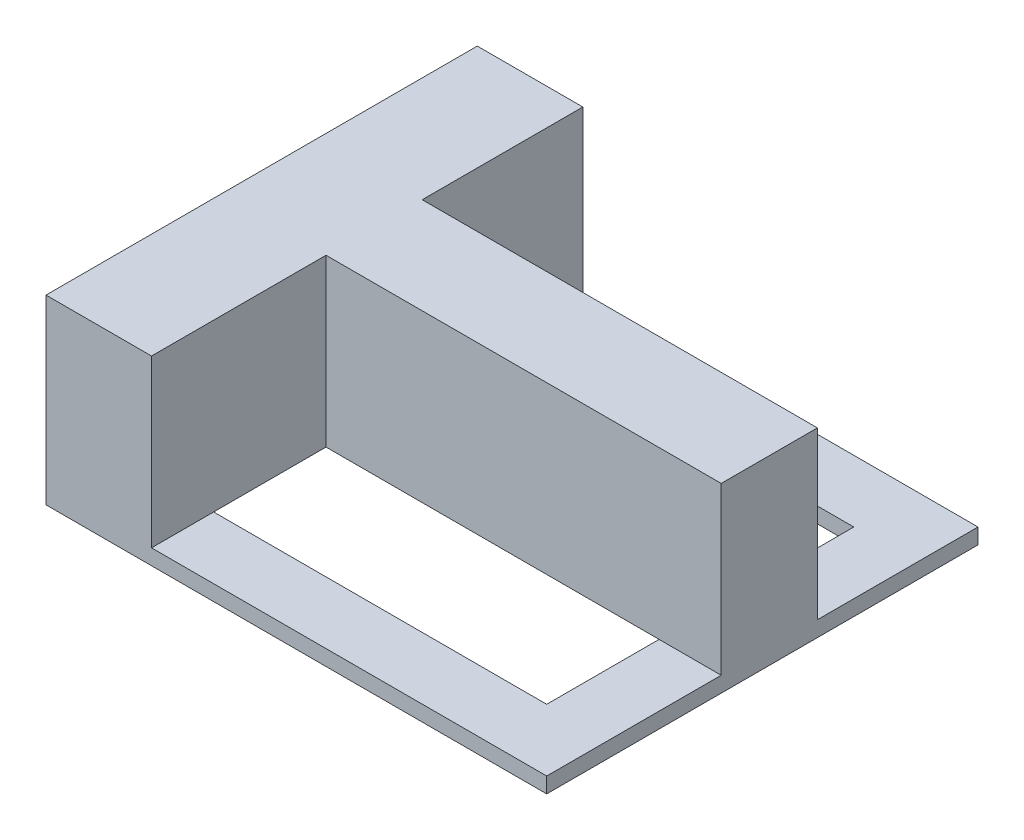
ISO-10303-21;
HEADER;
FILE_DESCRIPTION(('STEP AP214'),'2;1');
FILE_NAME('part.step','',(''),(''),'','','');
FILE_SCHEMA(('AUTOMOTIVE_DESIGN { 1 0 10303 214 1 1 1 1 }'));
ENDSEC;
DATA;
#1=APPLICATION_CONTEXT('core data for automotive mechanical design processes');
#2=APPLICATION_PROTOCOL_DEFINITION('international standard','automotive_design',2000,#1);
#3=PRODUCT_CONTEXT('',#1,'mechanical');
#4=PRODUCT('Part','Part','',(#3));
#5=PRODUCT_RELATED_PRODUCT_CATEGORY('part','',(#4));
#6=PRODUCT_DEFINITION_FORMATION('','',#4);
#7=PRODUCT_DEFINITION_CONTEXT('part definition',#1,'design');
#8=PRODUCT_DEFINITION('design','',#6,#7);
#9=PRODUCT_DEFINITION_SHAPE('','',#8);
#10=(LENGTH_UNIT() NAMED_UNIT(*) SI_UNIT(.MILLI.,.METRE.));
#11=(NAMED_UNIT(*) PLANE_ANGLE_UNIT() SI_UNIT($,.RADIAN.));
#12=(NAMED_UNIT(*) SI_UNIT($,.STERADIAN.) SOLID_ANGLE_UNIT());
#13=UNCERTAINTY_MEASURE_WITH_UNIT(LENGTH_MEASURE(1.E-05),#10,'distance_accuracy_value','');
#14=(GEOMETRIC_REPRESENTATION_CONTEXT(3) GLOBAL_UNCERTAINTY_ASSIGNED_CONTEXT((#13)) GLOBAL_UNIT_ASSIGNED_CONTEXT((#10,
#11,#12)) REPRESENTATION_CONTEXT('',''));
#15=CARTESIAN_POINT('',(0.,0.,0.));
#16=DIRECTION('',(0.,0.,1.));
#17=DIRECTION('',(1.,0.,0.));
#18=AXIS2_PLACEMENT_3D('',#15,#16,#17);
#19=CARTESIAN_POINT('',(0.,2.54,0.));
#20=DIRECTION('',(0.,1.,0.));
#21=DIRECTION('',(0.,0.,1.));
#22=AXIS2_PLACEMENT_3D('',#19,#20,#21);
#23=PLANE('',#22);
#24=DIRECTION('',(-1.,0.,0.));
#25=VECTOR('',#24,1.);
#26=CARTESIAN_POINT('',(0.,2.54,10.16));
#27=LINE('',#26,#25);
#28=CARTESIAN_POINT('',(71.7477166455847,2.54,10.16));
#29=VERTEX_POINT('',#28);
#30=CARTESIAN_POINT('',(17.262131752248,2.54,10.16));
#31=VERTEX_POINT('',#30);
#32=EDGE_CURVE('E237',#29,#31,#27,.T.);
#33=ORIENTED_EDGE('',*,*,#32,.F.);
#34=DIRECTION('',(0.,0.,-1.));
#35=VECTOR('',#34,1.);
#36=CARTESIAN_POINT('',(71.7477166455847,2.54,0.));
#37=LINE('',#36,#35);
#38=CARTESIAN_POINT('',(71.7477166455847,2.54,26.2734778975139));
#39=VERTEX_POINT('',#38);
#40=EDGE_CURVE('E218',#39,#29,#37,.T.);
#41=ORIENTED_EDGE('',*,*,#40,.F.);
#42=DIRECTION('',(-1.,0.,0.));
#43=VECTOR('',#42,1.);
#44=CARTESIAN_POINT('',(17.262131752248,2.54,26.2734778975139));
#45=LINE('',#44,#43);
#46=CARTESIAN_POINT('',(81.9077166455847,2.54,26.2734778975139));
#47=VERTEX_POINT('',#46);
#48=EDGE_CURVE('E289',#47,#39,#45,.T.);
#49=ORIENTED_EDGE('',*,*,#48,.F.);
#50=DIRECTION('',(0.,0.,-1.));
#51=VECTOR('',#50,1.);
#52=CARTESIAN_POINT('',(81.9077166455847,2.54,0.));
#53=LINE('',#52,#51);
#54=CARTESIAN_POINT('',(81.9077166455847,2.54,0.));
#55=VERTEX_POINT('',#54);
#56=EDGE_CURVE('E350',#47,#55,#53,.T.);
#57=ORIENTED_EDGE('',*,*,#56,.T.);
#58=DIRECTION('',(-1.,0.,0.));
#59=VECTOR('',#58,1.);
#60=CARTESIAN_POINT('',(0.,2.54,0.));
#61=LINE('',#60,#59);
#62=CARTESIAN_POINT('',(17.262131752248,2.54,0.));
#63=VERTEX_POINT('',#62);
#64=EDGE_CURVE('E356',#55,#63,#61,.T.);
#65=ORIENTED_EDGE('',*,*,#64,.T.);
#66=DIRECTION('',(0.,0.,-1.));
#67=VECTOR('',#66,1.);
#68=CARTESIAN_POINT('',(17.262131752248,2.54,0.));
#69=LINE('',#68,#67);
#70=EDGE_CURVE('E247',#31,#63,#69,.T.);
#71=ORIENTED_EDGE('',*,*,#70,.F.);
#72=EDGE_LOOP('',(#33,#41,#49,#57,#65,#71));
#73=FACE_BOUND('',#72,.T.);
#74=ADVANCED_FACE('F41',(#73),#23,.T.);
#75=CARTESIAN_POINT('',(71.7477166455847,2.54,60.3923286560832));
#76=VERTEX_POINT('',#75);
#77=CARTESIAN_POINT('',(71.7477166455847,2.54,42.006810195744));
#78=VERTEX_POINT('',#77);
#79=EDGE_CURVE('E67',#76,#78,#37,.T.);
#80=ORIENTED_EDGE('',*,*,#79,.F.);
#81=DIRECTION('',(1.,0.,0.));
#82=VECTOR('',#81,1.);
#83=CARTESIAN_POINT('',(0.,2.54,60.3923286560832));
#84=LINE('',#83,#82);
#85=CARTESIAN_POINT('',(17.262131752248,2.54,60.3923286560832));
#86=VERTEX_POINT('',#85);
#87=EDGE_CURVE('E498',#86,#76,#84,.T.);
#88=ORIENTED_EDGE('',*,*,#87,.F.);
#89=CARTESIAN_POINT('',(17.262131752248,2.54,70.5523286560832));
#90=VERTEX_POINT('',#89);
#91=EDGE_CURVE('E322',#90,#86,#69,.T.);
#92=ORIENTED_EDGE('',*,*,#91,.F.);
#93=DIRECTION('',(1.,0.,0.));
#94=VECTOR('',#93,1.);
#95=CARTESIAN_POINT('',(0.,2.54,70.5523286560832));
#96=LINE('',#95,#94);
#97=CARTESIAN_POINT('',(81.9077166455847,2.54,70.5523286560832));
#98=VERTEX_POINT('',#97);
#99=EDGE_CURVE('E347',#90,#98,#96,.T.);
#100=ORIENTED_EDGE('',*,*,#99,.T.);
#101=CARTESIAN_POINT('',(81.9077166455847,2.54,42.006810195744));
#102=VERTEX_POINT('',#101);
#103=EDGE_CURVE('E352',#98,#102,#53,.T.);
#104=ORIENTED_EDGE('',*,*,#103,.T.);
#105=DIRECTION('',(1.,0.,0.));
#106=VECTOR('',#105,1.);
#107=CARTESIAN_POINT('',(17.262131752248,2.54,42.006810195744));
#108=LINE('',#107,#106);
#109=EDGE_CURVE('E290',#78,#102,#108,.T.);
#110=ORIENTED_EDGE('',*,*,#109,.F.);
#111=EDGE_LOOP('',(#80,#88,#92,#100,#104,#110));
#112=FACE_BOUND('',#111,.T.);
#113=ADVANCED_FACE('F531',(#112),#23,.T.);
#114=CARTESIAN_POINT('',(0.,0.,0.));
#115=DIRECTION('',(0.,1.,0.));
#116=DIRECTION('',(0.,0.,1.));
#117=AXIS2_PLACEMENT_3D('',#114,#115,#116);
#118=PLANE('',#117);
#119=DIRECTION('',(0.,0.,1.));
#120=VECTOR('',#119,1.);
#121=CARTESIAN_POINT('',(0.,0.,0.));
#122=LINE('',#121,#120);
#123=CARTESIAN_POINT('',(0.,0.,0.));
#124=VERTEX_POINT('',#123);
#125=CARTESIAN_POINT('',(0.,0.,70.5523286560832));
#126=VERTEX_POINT('',#125);
#127=EDGE_CURVE('E346',#124,#126,#122,.T.);
#128=ORIENTED_EDGE('',*,*,#127,.F.);
#129=DIRECTION('',(-1.,0.,0.));
#130=VECTOR('',#129,1.);
#131=CARTESIAN_POINT('',(0.,0.,0.));
#132=LINE('',#131,#130);
#133=CARTESIAN_POINT('',(81.9077166455847,0.,0.));
#134=VERTEX_POINT('',#133);
#135=EDGE_CURVE('E351',#134,#124,#132,.T.);
#136=ORIENTED_EDGE('',*,*,#135,.F.);
#137=DIRECTION('',(0.,0.,-1.));
#138=VECTOR('',#137,1.);
#139=CARTESIAN_POINT('',(81.9077166455847,0.,0.));
#140=LINE('',#139,#138);
#141=CARTESIAN_POINT('',(81.9077166455847,0.,70.5523286560832));
#142=VERTEX_POINT('',#141);
#143=EDGE_CURVE('E366',#142,#134,#140,.T.);
#144=ORIENTED_EDGE('',*,*,#143,.F.);
#145=DIRECTION('',(1.,0.,0.));
#146=VECTOR('',#145,1.);
#147=CARTESIAN_POINT('',(0.,0.,70.5523286560832));
#148=LINE('',#147,#146);
#149=EDGE_CURVE('E363',#126,#142,#148,.T.);
#150=ORIENTED_EDGE('',*,*,#149,.F.);
#151=EDGE_LOOP('',(#128,#136,#144,#150));
#152=FACE_BOUND('',#151,.T.);
#153=DIRECTION('',(0.,0.,1.));
#154=VECTOR('',#153,1.);
#155=CARTESIAN_POINT('',(10.16,0.,0.));
#156=LINE('',#155,#154);
#157=CARTESIAN_POINT('',(10.16,0.,10.16));
#158=VERTEX_POINT('',#157);
#159=CARTESIAN_POINT('',(10.16,0.,60.3923286560832));
#160=VERTEX_POINT('',#159);
#161=EDGE_CURVE('E59',#158,#160,#156,.T.);
#162=ORIENTED_EDGE('',*,*,#161,.T.);
#163=DIRECTION('',(1.,0.,0.));
#164=VECTOR('',#163,1.);
#165=CARTESIAN_POINT('',(0.,0.,60.3923286560832));
#166=LINE('',#165,#164);
#167=CARTESIAN_POINT('',(71.7477166455847,0.,60.3923286560832));
#168=VERTEX_POINT('',#167);
#169=EDGE_CURVE('E506',#160,#168,#166,.T.);
#170=ORIENTED_EDGE('',*,*,#169,.T.);
#171=DIRECTION('',(0.,0.,-1.));
#172=VECTOR('',#171,1.);
#173=CARTESIAN_POINT('',(71.7477166455847,0.,0.));
#174=LINE('',#173,#172);
#175=CARTESIAN_POINT('',(71.7477166455847,0.,10.16));
#176=VERTEX_POINT('',#175);
#177=EDGE_CURVE('E503',#168,#176,#174,.T.);
#178=ORIENTED_EDGE('',*,*,#177,.T.);
#179=DIRECTION('',(-1.,0.,0.));
#180=VECTOR('',#179,1.);
#181=CARTESIAN_POINT('',(0.,0.,10.16));
#182=LINE('',#181,#180);
#183=EDGE_CURVE('E240',#176,#158,#182,.T.);
#184=ORIENTED_EDGE('',*,*,#183,.T.);
#185=EDGE_LOOP('',(#162,#170,#178,#184));
#186=FACE_BOUND('',#185,.T.);
#187=ADVANCED_FACE('F512',(#152,#186),#118,.F.);
#188=CARTESIAN_POINT('',(17.262131752248,29.718,0.));
#189=DIRECTION('',(-1.,0.,0.));
#190=DIRECTION('',(0.,0.,1.));
#191=AXIS2_PLACEMENT_3D('',#188,#189,#190);
#192=PLANE('',#191);
#193=DIRECTION('',(0.,0.,-1.));
#194=VECTOR('',#193,1.);
#195=CARTESIAN_POINT('',(17.262131752248,29.718,0.));
#196=LINE('',#195,#194);
#197=CARTESIAN_POINT('',(17.262131752248,29.718,26.2734778975139));
#198=VERTEX_POINT('',#197);
#199=CARTESIAN_POINT('',(17.262131752248,29.718,0.));
#200=VERTEX_POINT('',#199);
#201=EDGE_CURVE('E325',#198,#200,#196,.T.);
#202=ORIENTED_EDGE('',*,*,#201,.F.);
#203=DIRECTION('',(0.,1.,0.));
#204=VECTOR('',#203,1.);
#205=CARTESIAN_POINT('',(17.262131752248,2.54,26.2734778975139));
#206=LINE('',#205,#204);
#207=CARTESIAN_POINT('',(17.262131752248,2.54,26.2734778975139));
#208=VERTEX_POINT('',#207);
#209=EDGE_CURVE('E304',#208,#198,#206,.T.);
#210=ORIENTED_EDGE('',*,*,#209,.F.);
#211=EDGE_CURVE('E338',#208,#31,#69,.T.);
#212=ORIENTED_EDGE('',*,*,#211,.T.);
#213=ORIENTED_EDGE('',*,*,#70,.T.);
#214=DIRECTION('',(0.,-1.,0.));
#215=VECTOR('',#214,1.);
#216=CARTESIAN_POINT('',(17.262131752248,29.718,0.));
#217=LINE('',#216,#215);
#218=EDGE_CURVE('E334',#200,#63,#217,.T.);
#219=ORIENTED_EDGE('',*,*,#218,.F.);
#220=EDGE_LOOP('',(#202,#210,#212,#213,#219));
#221=FACE_BOUND('',#220,.T.);
#222=ADVANCED_FACE('F543',(#221),#192,.F.);
#223=CARTESIAN_POINT('',(0.,2.54,0.));
#224=DIRECTION('',(1.,0.,0.));
#225=DIRECTION('',(0.,0.,-1.));
#226=AXIS2_PLACEMENT_3D('',#223,#224,#225);
#227=PLANE('',#226);
#228=ORIENTED_EDGE('',*,*,#127,.T.);
#229=DIRECTION('',(0.,-1.,0.));
#230=VECTOR('',#229,1.);
#231=CARTESIAN_POINT('',(0.,2.54,70.5523286560832));
#232=LINE('',#231,#230);
#233=CARTESIAN_POINT('',(0.,29.718,70.5523286560832));
#234=VERTEX_POINT('',#233);
#235=EDGE_CURVE('E382',#234,#126,#232,.T.);
#236=ORIENTED_EDGE('',*,*,#235,.F.);
#237=DIRECTION('',(0.,0.,1.));
#238=VECTOR('',#237,1.);
#239=CARTESIAN_POINT('',(0.,29.718,0.));
#240=LINE('',#239,#238);
#241=CARTESIAN_POINT('',(0.,29.718,0.));
#242=VERTEX_POINT('',#241);
#243=EDGE_CURVE('E317',#242,#234,#240,.T.);
#244=ORIENTED_EDGE('',*,*,#243,.F.);
#245=DIRECTION('',(0.,-1.,0.));
#246=VECTOR('',#245,1.);
#247=CARTESIAN_POINT('',(0.,2.54,0.));
#248=LINE('',#247,#246);
#249=EDGE_CURVE('E359',#242,#124,#248,.T.);
#250=ORIENTED_EDGE('',*,*,#249,.T.);
#251=EDGE_LOOP('',(#228,#236,#244,#250));
#252=FACE_BOUND('',#251,.T.);
#253=ADVANCED_FACE('F556',(#252),#227,.F.);
#254=CARTESIAN_POINT('',(0.,2.54,70.5523286560832));
#255=DIRECTION('',(0.,0.,-1.));
#256=DIRECTION('',(-1.,0.,0.));
#257=AXIS2_PLACEMENT_3D('',#254,#255,#256);
#258=PLANE('',#257);
#259=ORIENTED_EDGE('',*,*,#149,.T.);
#260=DIRECTION('',(0.,-1.,0.));
#261=VECTOR('',#260,1.);
#262=CARTESIAN_POINT('',(81.9077166455847,2.54,70.5523286560832));
#263=LINE('',#262,#261);
#264=EDGE_CURVE('E378',#98,#142,#263,.T.);
#265=ORIENTED_EDGE('',*,*,#264,.F.);
#266=ORIENTED_EDGE('',*,*,#99,.F.);
#267=DIRECTION('',(0.,-1.,0.));
#268=VECTOR('',#267,1.);
#269=CARTESIAN_POINT('',(17.262131752248,29.718,70.5523286560832));
#270=LINE('',#269,#268);
#271=CARTESIAN_POINT('',(17.262131752248,29.718,70.5523286560832));
#272=VERTEX_POINT('',#271);
#273=EDGE_CURVE('E342',#272,#90,#270,.T.);
#274=ORIENTED_EDGE('',*,*,#273,.F.);
#275=DIRECTION('',(1.,0.,0.));
#276=VECTOR('',#275,1.);
#277=CARTESIAN_POINT('',(0.,29.718,70.5523286560832));
#278=LINE('',#277,#276);
#279=EDGE_CURVE('E321',#234,#272,#278,.T.);
#280=ORIENTED_EDGE('',*,*,#279,.F.);
#281=ORIENTED_EDGE('',*,*,#235,.T.);
#282=EDGE_LOOP('',(#259,#265,#266,#274,#280,#281));
#283=FACE_BOUND('',#282,.T.);
#284=ADVANCED_FACE('F552',(#283),#258,.F.);
#285=CARTESIAN_POINT('',(81.9077166455847,2.54,0.));
#286=DIRECTION('',(-1.,0.,0.));
#287=DIRECTION('',(0.,0.,1.));
#288=AXIS2_PLACEMENT_3D('',#285,#286,#287);
#289=PLANE('',#288);
#290=ORIENTED_EDGE('',*,*,#143,.T.);
#291=DIRECTION('',(0.,-1.,0.));
#292=VECTOR('',#291,1.);
#293=CARTESIAN_POINT('',(81.9077166455847,2.54,0.));
#294=LINE('',#293,#292);
#295=EDGE_CURVE('E374',#55,#134,#294,.T.);
#296=ORIENTED_EDGE('',*,*,#295,.F.);
#297=ORIENTED_EDGE('',*,*,#56,.F.);
#298=DIRECTION('',(0.,1.,0.));
#299=VECTOR('',#298,1.);
#300=CARTESIAN_POINT('',(81.9077166455847,2.54,26.2734778975139));
#301=LINE('',#300,#299);
#302=CARTESIAN_POINT('',(81.9077166455847,29.718,26.2734778975139));
#303=VERTEX_POINT('',#302);
#304=EDGE_CURVE('E308',#47,#303,#301,.T.);
#305=ORIENTED_EDGE('',*,*,#304,.T.);
#306=DIRECTION('',(0.,0.,-1.));
#307=VECTOR('',#306,1.);
#308=CARTESIAN_POINT('',(81.9077166455847,29.718,26.2734778975139));
#309=LINE('',#308,#307);
#310=CARTESIAN_POINT('',(81.9077166455847,29.718,42.006810195744));
#311=VERTEX_POINT('',#310);
#312=EDGE_CURVE('E297',#311,#303,#309,.T.);
#313=ORIENTED_EDGE('',*,*,#312,.F.);
#314=DIRECTION('',(0.,1.,0.));
#315=VECTOR('',#314,1.);
#316=CARTESIAN_POINT('',(81.9077166455847,2.54,42.006810195744));
#317=LINE('',#316,#315);
#318=EDGE_CURVE('E311',#102,#311,#317,.T.);
#319=ORIENTED_EDGE('',*,*,#318,.F.);
#320=ORIENTED_EDGE('',*,*,#103,.F.);
#321=ORIENTED_EDGE('',*,*,#264,.T.);
#322=EDGE_LOOP('',(#290,#296,#297,#305,#313,#319,#320,#321));
#323=FACE_BOUND('',#322,.T.);
#324=ADVANCED_FACE('F548',(#323),#289,.F.);
#325=CARTESIAN_POINT('',(0.,2.54,0.));
#326=DIRECTION('',(0.,0.,1.));
#327=DIRECTION('',(1.,0.,0.));
#328=AXIS2_PLACEMENT_3D('',#325,#326,#327);
#329=PLANE('',#328);
#330=ORIENTED_EDGE('',*,*,#135,.T.);
#331=ORIENTED_EDGE('',*,*,#249,.F.);
#332=DIRECTION('',(-1.,0.,0.));
#333=VECTOR('',#332,1.);
#334=CARTESIAN_POINT('',(0.,29.718,0.));
#335=LINE('',#334,#333);
#336=EDGE_CURVE('E330',#200,#242,#335,.T.);
#337=ORIENTED_EDGE('',*,*,#336,.F.);
#338=ORIENTED_EDGE('',*,*,#218,.T.);
#339=ORIENTED_EDGE('',*,*,#64,.F.);
#340=ORIENTED_EDGE('',*,*,#295,.T.);
#341=EDGE_LOOP('',(#330,#331,#337,#338,#339,#340));
#342=FACE_BOUND('',#341,.T.);
#343=ADVANCED_FACE('F545',(#342),#329,.F.);
#344=ORIENTED_EDGE('',*,*,#91,.T.);
#345=DIRECTION('',(0.,0.,-1.));
#346=VECTOR('',#345,1.);
#347=CARTESIAN_POINT('',(17.262131752248,2.54,0.));
#348=LINE('',#347,#346);
#349=CARTESIAN_POINT('',(17.262131752248,2.54,42.006810195744));
#350=VERTEX_POINT('',#349);
#351=EDGE_CURVE('E277',#86,#350,#348,.T.);
#352=ORIENTED_EDGE('',*,*,#351,.T.);
#353=DIRECTION('',(0.,1.,0.));
#354=VECTOR('',#353,1.);
#355=CARTESIAN_POINT('',(17.262131752248,2.54,42.006810195744));
#356=LINE('',#355,#354);
#357=CARTESIAN_POINT('',(17.262131752248,29.718,42.006810195744));
#358=VERTEX_POINT('',#357);
#359=EDGE_CURVE('E293',#350,#358,#356,.T.);
#360=ORIENTED_EDGE('',*,*,#359,.T.);
#361=EDGE_CURVE('E326',#272,#358,#196,.T.);
#362=ORIENTED_EDGE('',*,*,#361,.F.);
#363=ORIENTED_EDGE('',*,*,#273,.T.);
#364=EDGE_LOOP('',(#344,#352,#360,#362,#363));
#365=FACE_BOUND('',#364,.T.);
#366=ADVANCED_FACE('F539',(#365),#192,.F.);
#367=CARTESIAN_POINT('',(0.,29.718,0.));
#368=DIRECTION('',(0.,1.,0.));
#369=DIRECTION('',(0.,0.,1.));
#370=AXIS2_PLACEMENT_3D('',#367,#368,#369);
#371=PLANE('',#370);
#372=ORIENTED_EDGE('',*,*,#243,.T.);
#373=ORIENTED_EDGE('',*,*,#279,.T.);
#374=ORIENTED_EDGE('',*,*,#361,.T.);
#375=DIRECTION('',(1.,0.,0.));
#376=VECTOR('',#375,1.);
#377=CARTESIAN_POINT('',(17.262131752248,29.718,42.006810195744));
#378=LINE('',#377,#376);
#379=EDGE_CURVE('E284',#358,#311,#378,.T.);
#380=ORIENTED_EDGE('',*,*,#379,.T.);
#381=ORIENTED_EDGE('',*,*,#312,.T.);
#382=DIRECTION('',(-1.,0.,0.));
#383=VECTOR('',#382,1.);
#384=CARTESIAN_POINT('',(17.262131752248,29.718,26.2734778975139));
#385=LINE('',#384,#383);
#386=EDGE_CURVE('E301',#303,#198,#385,.T.);
#387=ORIENTED_EDGE('',*,*,#386,.T.);
#388=ORIENTED_EDGE('',*,*,#201,.T.);
#389=ORIENTED_EDGE('',*,*,#336,.T.);
#390=EDGE_LOOP('',(#372,#373,#374,#380,#381,#387,#388,#389));
#391=FACE_BOUND('',#390,.T.);
#392=ADVANCED_FACE('F638',(#391),#371,.T.);
#393=CARTESIAN_POINT('',(17.262131752248,2.54,26.2734778975139));
#394=DIRECTION('',(0.,0.,-1.));
#395=DIRECTION('',(-1.,0.,0.));
#396=AXIS2_PLACEMENT_3D('',#393,#394,#395);
#397=PLANE('',#396);
#398=ORIENTED_EDGE('',*,*,#386,.F.);
#399=ORIENTED_EDGE('',*,*,#304,.F.);
#400=ORIENTED_EDGE('',*,*,#48,.T.);
#401=DIRECTION('',(1.,0.,0.));
#402=VECTOR('',#401,1.);
#403=CARTESIAN_POINT('',(17.262131752248,2.54,26.2734778975139));
#404=LINE('',#403,#402);
#405=EDGE_CURVE('E281',#208,#39,#404,.T.);
#406=ORIENTED_EDGE('',*,*,#405,.F.);
#407=ORIENTED_EDGE('',*,*,#209,.T.);
#408=EDGE_LOOP('',(#398,#399,#400,#406,#407));
#409=FACE_BOUND('',#408,.T.);
#410=ADVANCED_FACE('F636',(#409),#397,.T.);
#411=CARTESIAN_POINT('',(17.262131752248,2.54,42.006810195744));
#412=DIRECTION('',(0.,0.,1.));
#413=DIRECTION('',(1.,0.,0.));
#414=AXIS2_PLACEMENT_3D('',#411,#412,#413);
#415=PLANE('',#414);
#416=ORIENTED_EDGE('',*,*,#379,.F.);
#417=ORIENTED_EDGE('',*,*,#359,.F.);
#418=EDGE_CURVE('E285',#350,#78,#108,.T.);
#419=ORIENTED_EDGE('',*,*,#418,.T.);
#420=ORIENTED_EDGE('',*,*,#109,.T.);
#421=ORIENTED_EDGE('',*,*,#318,.T.);
#422=EDGE_LOOP('',(#416,#417,#419,#420,#421));
#423=FACE_BOUND('',#422,.T.);
#424=ADVANCED_FACE('F618',(#423),#415,.T.);
#425=CARTESIAN_POINT('',(0.,2.54,0.));
#426=DIRECTION('',(0.,1.,0.));
#427=DIRECTION('',(0.,0.,1.));
#428=AXIS2_PLACEMENT_3D('',#425,#426,#427);
#429=PLANE('',#428);
#430=ORIENTED_EDGE('',*,*,#405,.T.);
#431=CARTESIAN_POINT('',(71.7477166455847,2.54,28.8134778975139));
#432=VERTEX_POINT('',#431);
#433=EDGE_CURVE('E225',#432,#39,#37,.T.);
#434=ORIENTED_EDGE('',*,*,#433,.F.);
#435=DIRECTION('',(1.,0.,0.));
#436=VECTOR('',#435,1.);
#437=CARTESIAN_POINT('',(17.262131752248,2.54,28.8134778975139));
#438=LINE('',#437,#436);
#439=CARTESIAN_POINT('',(14.722131752248,2.54,28.8134778975139));
#440=VERTEX_POINT('',#439);
#441=EDGE_CURVE('E434',#440,#432,#438,.T.);
#442=ORIENTED_EDGE('',*,*,#441,.F.);
#443=DIRECTION('',(0.,0.,-1.));
#444=VECTOR('',#443,1.);
#445=CARTESIAN_POINT('',(14.722131752248,2.54,0.));
#446=LINE('',#445,#444);
#447=CARTESIAN_POINT('',(14.722131752248,2.54,10.16));
#448=VERTEX_POINT('',#447);
#449=EDGE_CURVE('E274',#440,#448,#446,.T.);
#450=ORIENTED_EDGE('',*,*,#449,.T.);
#451=EDGE_CURVE('E250',#31,#448,#27,.T.);
#452=ORIENTED_EDGE('',*,*,#451,.F.);
#453=ORIENTED_EDGE('',*,*,#211,.F.);
#454=EDGE_LOOP('',(#430,#434,#442,#450,#452,#453));
#455=FACE_BOUND('',#454,.T.);
#456=ADVANCED_FACE('F527',(#455),#429,.F.);
#457=CARTESIAN_POINT('',(14.722131752248,2.54,60.3923286560832));
#458=VERTEX_POINT('',#457);
#459=EDGE_CURVE('E497',#458,#86,#84,.T.);
#460=ORIENTED_EDGE('',*,*,#459,.F.);
#461=DIRECTION('',(0.,0.,-1.));
#462=VECTOR('',#461,1.);
#463=CARTESIAN_POINT('',(14.722131752248,2.54,0.));
#464=LINE('',#463,#462);
#465=CARTESIAN_POINT('',(14.722131752248,2.54,39.466810195744));
#466=VERTEX_POINT('',#465);
#467=EDGE_CURVE('E270',#458,#466,#464,.T.);
#468=ORIENTED_EDGE('',*,*,#467,.T.);
#469=DIRECTION('',(1.,0.,0.));
#470=VECTOR('',#469,1.);
#471=CARTESIAN_POINT('',(0.,2.54,39.466810195744));
#472=LINE('',#471,#470);
#473=CARTESIAN_POINT('',(71.7477166455847,2.54,39.466810195744));
#474=VERTEX_POINT('',#473);
#475=EDGE_CURVE('E51',#466,#474,#472,.T.);
#476=ORIENTED_EDGE('',*,*,#475,.T.);
#477=EDGE_CURVE('E261',#78,#474,#37,.T.);
#478=ORIENTED_EDGE('',*,*,#477,.F.);
#479=ORIENTED_EDGE('',*,*,#418,.F.);
#480=ORIENTED_EDGE('',*,*,#351,.F.);
#481=EDGE_LOOP('',(#460,#468,#476,#478,#479,#480));
#482=FACE_BOUND('',#481,.T.);
#483=ADVANCED_FACE('F520',(#482),#429,.F.);
#484=CARTESIAN_POINT('',(10.16,2.54,0.));
#485=DIRECTION('',(1.,0.,0.));
#486=DIRECTION('',(0.,0.,-1.));
#487=AXIS2_PLACEMENT_3D('',#484,#485,#486);
#488=PLANE('',#487);
#489=DIRECTION('',(0.,0.,1.));
#490=VECTOR('',#489,1.);
#491=CARTESIAN_POINT('',(10.16,2.54,0.));
#492=LINE('',#491,#490);
#493=CARTESIAN_POINT('',(10.16,2.54,10.16));
#494=VERTEX_POINT('',#493);
#495=CARTESIAN_POINT('',(10.16,2.54,60.3923286560832));
#496=VERTEX_POINT('',#495);
#497=EDGE_CURVE('E267',#494,#496,#492,.T.);
#498=ORIENTED_EDGE('',*,*,#497,.T.);
#499=DIRECTION('',(0.,-1.,0.));
#500=VECTOR('',#499,1.);
#501=CARTESIAN_POINT('',(10.16,2.54,60.3923286560832));
#502=LINE('',#501,#500);
#503=EDGE_CURVE('E271',#496,#160,#502,.T.);
#504=ORIENTED_EDGE('',*,*,#503,.T.);
#505=ORIENTED_EDGE('',*,*,#161,.F.);
#506=DIRECTION('',(0.,-1.,0.));
#507=VECTOR('',#506,1.);
#508=CARTESIAN_POINT('',(10.16,2.54,10.16));
#509=LINE('',#508,#507);
#510=EDGE_CURVE('E244',#494,#158,#509,.T.);
#511=ORIENTED_EDGE('',*,*,#510,.F.);
#512=EDGE_LOOP('',(#498,#504,#505,#511));
#513=FACE_BOUND('',#512,.T.);
#514=ADVANCED_FACE('F518',(#513),#488,.T.);
#515=CARTESIAN_POINT('',(0.,2.54,60.3923286560832));
#516=DIRECTION('',(0.,0.,-1.));
#517=DIRECTION('',(-1.,0.,0.));
#518=AXIS2_PLACEMENT_3D('',#515,#516,#517);
#519=PLANE('',#518);
#520=ORIENTED_EDGE('',*,*,#169,.F.);
#521=ORIENTED_EDGE('',*,*,#503,.F.);
#522=EDGE_CURVE('E231',#496,#458,#84,.T.);
#523=ORIENTED_EDGE('',*,*,#522,.T.);
#524=ORIENTED_EDGE('',*,*,#459,.T.);
#525=ORIENTED_EDGE('',*,*,#87,.T.);
#526=DIRECTION('',(0.,-1.,0.));
#527=VECTOR('',#526,1.);
#528=CARTESIAN_POINT('',(71.7477166455847,2.54,60.3923286560832));
#529=LINE('',#528,#527);
#530=EDGE_CURVE('E243',#76,#168,#529,.T.);
#531=ORIENTED_EDGE('',*,*,#530,.T.);
#532=EDGE_LOOP('',(#520,#521,#523,#524,#525,#531));
#533=FACE_BOUND('',#532,.T.);
#534=ADVANCED_FACE('F514',(#533),#519,.T.);
#535=CARTESIAN_POINT('',(71.7477166455847,2.54,0.));
#536=DIRECTION('',(-1.,0.,0.));
#537=DIRECTION('',(0.,0.,1.));
#538=AXIS2_PLACEMENT_3D('',#535,#536,#537);
#539=PLANE('',#538);
#540=ORIENTED_EDGE('',*,*,#177,.F.);
#541=ORIENTED_EDGE('',*,*,#530,.F.);
#542=ORIENTED_EDGE('',*,*,#79,.T.);
#543=ORIENTED_EDGE('',*,*,#477,.T.);
#544=EDGE_CURVE('E263',#474,#432,#37,.T.);
#545=ORIENTED_EDGE('',*,*,#544,.T.);
#546=ORIENTED_EDGE('',*,*,#433,.T.);
#547=ORIENTED_EDGE('',*,*,#40,.T.);
#548=DIRECTION('',(0.,-1.,0.));
#549=VECTOR('',#548,1.);
#550=CARTESIAN_POINT('',(71.7477166455847,2.54,10.16));
#551=LINE('',#550,#549);
#552=EDGE_CURVE('E222',#29,#176,#551,.T.);
#553=ORIENTED_EDGE('',*,*,#552,.T.);
#554=EDGE_LOOP('',(#540,#541,#542,#543,#545,#546,#547,#553));
#555=FACE_BOUND('',#554,.T.);
#556=ADVANCED_FACE('F221',(#555),#539,.T.);
#557=CARTESIAN_POINT('',(0.,2.54,10.16));
#558=DIRECTION('',(0.,0.,1.));
#559=DIRECTION('',(1.,0.,0.));
#560=AXIS2_PLACEMENT_3D('',#557,#558,#559);
#561=PLANE('',#560);
#562=ORIENTED_EDGE('',*,*,#183,.F.);
#563=ORIENTED_EDGE('',*,*,#552,.F.);
#564=ORIENTED_EDGE('',*,*,#32,.T.);
#565=ORIENTED_EDGE('',*,*,#451,.T.);
#566=EDGE_CURVE('E252',#448,#494,#27,.T.);
#567=ORIENTED_EDGE('',*,*,#566,.T.);
#568=ORIENTED_EDGE('',*,*,#510,.T.);
#569=EDGE_LOOP('',(#562,#563,#564,#565,#567,#568));
#570=FACE_BOUND('',#569,.T.);
#571=ADVANCED_FACE('F235',(#570),#561,.T.);
#572=CARTESIAN_POINT('',(0.,2.54,0.));
#573=DIRECTION('',(0.,1.,0.));
#574=DIRECTION('',(0.,0.,1.));
#575=AXIS2_PLACEMENT_3D('',#572,#573,#574);
#576=PLANE('',#575);
#577=CARTESIAN_POINT('',(79.3677166455847,2.54,28.8134778975139));
#578=VERTEX_POINT('',#577);
#579=EDGE_CURVE('E438',#432,#578,#438,.T.);
#580=ORIENTED_EDGE('',*,*,#579,.F.);
#581=ORIENTED_EDGE('',*,*,#544,.F.);
#582=CARTESIAN_POINT('',(79.3677166455847,2.54,39.466810195744));
#583=VERTEX_POINT('',#582);
#584=EDGE_CURVE('E388',#474,#583,#472,.T.);
#585=ORIENTED_EDGE('',*,*,#584,.T.);
#586=DIRECTION('',(0.,0.,-1.));
#587=VECTOR('',#586,1.);
#588=CARTESIAN_POINT('',(79.3677166455847,2.54,0.));
#589=LINE('',#588,#587);
#590=EDGE_CURVE('E453',#583,#578,#589,.T.);
#591=ORIENTED_EDGE('',*,*,#590,.T.);
#592=EDGE_LOOP('',(#580,#581,#585,#591));
#593=FACE_BOUND('',#592,.T.);
#594=ADVANCED_FACE('F576',(#593),#576,.T.);
#595=DIRECTION('',(0.,0.,-1.));
#596=VECTOR('',#595,1.);
#597=CARTESIAN_POINT('',(14.722131752248,2.54,0.));
#598=LINE('',#597,#596);
#599=CARTESIAN_POINT('',(14.722131752248,2.54,68.0123286560832));
#600=VERTEX_POINT('',#599);
#601=EDGE_CURVE('E426',#600,#458,#598,.T.);
#602=ORIENTED_EDGE('',*,*,#601,.T.);
#603=ORIENTED_EDGE('',*,*,#522,.F.);
#604=ORIENTED_EDGE('',*,*,#497,.F.);
#605=ORIENTED_EDGE('',*,*,#566,.F.);
#606=DIRECTION('',(0.,0.,1.));
#607=VECTOR('',#606,1.);
#608=CARTESIAN_POINT('',(14.722131752248,2.54,0.));
#609=LINE('',#608,#607);
#610=CARTESIAN_POINT('',(14.722131752248,2.54,2.54));
#611=VERTEX_POINT('',#610);
#612=EDGE_CURVE('E439',#611,#448,#609,.T.);
#613=ORIENTED_EDGE('',*,*,#612,.F.);
#614=DIRECTION('',(-1.,0.,0.));
#615=VECTOR('',#614,1.);
#616=CARTESIAN_POINT('',(0.,2.54,2.54));
#617=LINE('',#616,#615);
#618=CARTESIAN_POINT('',(2.54,2.54,2.54));
#619=VERTEX_POINT('',#618);
#620=EDGE_CURVE('E443',#611,#619,#617,.T.);
#621=ORIENTED_EDGE('',*,*,#620,.T.);
#622=DIRECTION('',(0.,0.,1.));
#623=VECTOR('',#622,1.);
#624=CARTESIAN_POINT('',(2.54,2.54,0.));
#625=LINE('',#624,#623);
#626=CARTESIAN_POINT('',(2.54,2.54,68.0123286560832));
#627=VERTEX_POINT('',#626);
#628=EDGE_CURVE('E45',#619,#627,#625,.T.);
#629=ORIENTED_EDGE('',*,*,#628,.T.);
#630=DIRECTION('',(1.,0.,0.));
#631=VECTOR('',#630,1.);
#632=CARTESIAN_POINT('',(0.,2.54,68.0123286560832));
#633=LINE('',#632,#631);
#634=EDGE_CURVE('E461',#627,#600,#633,.T.);
#635=ORIENTED_EDGE('',*,*,#634,.T.);
#636=EDGE_LOOP('',(#602,#603,#604,#605,#613,#621,#629,#635));
#637=FACE_BOUND('',#636,.T.);
#638=ADVANCED_FACE('F473',(#637),#576,.T.);
#639=CARTESIAN_POINT('',(14.722131752248,29.718,0.));
#640=DIRECTION('',(-1.,0.,0.));
#641=DIRECTION('',(0.,0.,1.));
#642=AXIS2_PLACEMENT_3D('',#639,#640,#641);
#643=PLANE('',#642);
#644=ORIENTED_EDGE('',*,*,#612,.T.);
#645=ORIENTED_EDGE('',*,*,#449,.F.);
#646=DIRECTION('',(0.,1.,0.));
#647=VECTOR('',#646,1.);
#648=CARTESIAN_POINT('',(14.722131752248,2.54,28.8134778975139));
#649=LINE('',#648,#647);
#650=CARTESIAN_POINT('',(14.722131752248,27.178,28.8134778975139));
#651=VERTEX_POINT('',#650);
#652=EDGE_CURVE('E389',#440,#651,#649,.T.);
#653=ORIENTED_EDGE('',*,*,#652,.T.);
#654=DIRECTION('',(0.,0.,-1.));
#655=VECTOR('',#654,1.);
#656=CARTESIAN_POINT('',(14.722131752248,27.178,0.));
#657=LINE('',#656,#655);
#658=CARTESIAN_POINT('',(14.722131752248,27.178,2.54));
#659=VERTEX_POINT('',#658);
#660=EDGE_CURVE('E396',#651,#659,#657,.T.);
#661=ORIENTED_EDGE('',*,*,#660,.T.);
#662=DIRECTION('',(0.,-1.,0.));
#663=VECTOR('',#662,1.);
#664=CARTESIAN_POINT('',(14.722131752248,2.54,2.54));
#665=LINE('',#664,#663);
#666=EDGE_CURVE('E446',#659,#611,#665,.T.);
#667=ORIENTED_EDGE('',*,*,#666,.T.);
#668=EDGE_LOOP('',(#644,#645,#653,#661,#667));
#669=FACE_BOUND('',#668,.T.);
#670=ADVANCED_FACE('F561',(#669),#643,.T.);
#671=CARTESIAN_POINT('',(2.54,2.54,0.));
#672=DIRECTION('',(1.,0.,0.));
#673=DIRECTION('',(0.,0.,-1.));
#674=AXIS2_PLACEMENT_3D('',#671,#672,#673);
#675=PLANE('',#674);
#676=ORIENTED_EDGE('',*,*,#628,.F.);
#677=DIRECTION('',(0.,-1.,0.));
#678=VECTOR('',#677,1.);
#679=CARTESIAN_POINT('',(2.54,2.54,2.54));
#680=LINE('',#679,#678);
#681=CARTESIAN_POINT('',(2.54,27.178,2.54));
#682=VERTEX_POINT('',#681);
#683=EDGE_CURVE('E464',#682,#619,#680,.T.);
#684=ORIENTED_EDGE('',*,*,#683,.F.);
#685=DIRECTION('',(0.,0.,1.));
#686=VECTOR('',#685,1.);
#687=CARTESIAN_POINT('',(2.54,27.178,0.));
#688=LINE('',#687,#686);
#689=CARTESIAN_POINT('',(2.54,27.178,68.0123286560832));
#690=VERTEX_POINT('',#689);
#691=EDGE_CURVE('E419',#682,#690,#688,.T.);
#692=ORIENTED_EDGE('',*,*,#691,.T.);
#693=DIRECTION('',(0.,-1.,0.));
#694=VECTOR('',#693,1.);
#695=CARTESIAN_POINT('',(2.54,2.54,68.0123286560832));
#696=LINE('',#695,#694);
#697=EDGE_CURVE('E457',#690,#627,#696,.T.);
#698=ORIENTED_EDGE('',*,*,#697,.T.);
#699=EDGE_LOOP('',(#676,#684,#692,#698));
#700=FACE_BOUND('',#699,.T.);
#701=ADVANCED_FACE('F475',(#700),#675,.T.);
#702=CARTESIAN_POINT('',(0.,2.54,68.0123286560832));
#703=DIRECTION('',(0.,0.,-1.));
#704=DIRECTION('',(-1.,0.,0.));
#705=AXIS2_PLACEMENT_3D('',#702,#703,#704);
#706=PLANE('',#705);
#707=ORIENTED_EDGE('',*,*,#634,.F.);
#708=ORIENTED_EDGE('',*,*,#697,.F.);
#709=DIRECTION('',(1.,0.,0.));
#710=VECTOR('',#709,1.);
#711=CARTESIAN_POINT('',(0.,27.178,68.0123286560832));
#712=LINE('',#711,#710);
#713=CARTESIAN_POINT('',(14.722131752248,27.178,68.0123286560832));
#714=VERTEX_POINT('',#713);
#715=EDGE_CURVE('E415',#690,#714,#712,.T.);
#716=ORIENTED_EDGE('',*,*,#715,.T.);
#717=DIRECTION('',(0.,-1.,0.));
#718=VECTOR('',#717,1.);
#719=CARTESIAN_POINT('',(14.722131752248,29.718,68.0123286560832));
#720=LINE('',#719,#718);
#721=EDGE_CURVE('E430',#714,#600,#720,.T.);
#722=ORIENTED_EDGE('',*,*,#721,.T.);
#723=EDGE_LOOP('',(#707,#708,#716,#722));
#724=FACE_BOUND('',#723,.T.);
#725=ADVANCED_FACE('F479',(#724),#706,.T.);
#726=CARTESIAN_POINT('',(79.3677166455847,2.54,0.));
#727=DIRECTION('',(-1.,0.,0.));
#728=DIRECTION('',(0.,0.,1.));
#729=AXIS2_PLACEMENT_3D('',#726,#727,#728);
#730=PLANE('',#729);
#731=DIRECTION('',(0.,1.,0.));
#732=VECTOR('',#731,1.);
#733=CARTESIAN_POINT('',(79.3677166455847,2.54,39.466810195744));
#734=LINE('',#733,#732);
#735=CARTESIAN_POINT('',(79.3677166455847,27.178,39.466810195744));
#736=VERTEX_POINT('',#735);
#737=EDGE_CURVE('E11',#583,#736,#734,.T.);
#738=ORIENTED_EDGE('',*,*,#737,.T.);
#739=DIRECTION('',(0.,0.,-1.));
#740=VECTOR('',#739,1.);
#741=CARTESIAN_POINT('',(79.3677166455847,27.178,0.));
#742=LINE('',#741,#740);
#743=CARTESIAN_POINT('',(79.3677166455847,27.178,28.8134778975139));
#744=VERTEX_POINT('',#743);
#745=EDGE_CURVE('E403',#736,#744,#742,.T.);
#746=ORIENTED_EDGE('',*,*,#745,.T.);
#747=DIRECTION('',(0.,1.,0.));
#748=VECTOR('',#747,1.);
#749=CARTESIAN_POINT('',(79.3677166455847,2.54,28.8134778975139));
#750=LINE('',#749,#748);
#751=EDGE_CURVE('E450',#578,#744,#750,.T.);
#752=ORIENTED_EDGE('',*,*,#751,.F.);
#753=ORIENTED_EDGE('',*,*,#590,.F.);
#754=EDGE_LOOP('',(#738,#746,#752,#753));
#755=FACE_BOUND('',#754,.T.);
#756=ADVANCED_FACE('F569',(#755),#730,.T.);
#757=CARTESIAN_POINT('',(0.,2.54,2.54));
#758=DIRECTION('',(0.,0.,1.));
#759=DIRECTION('',(1.,0.,0.));
#760=AXIS2_PLACEMENT_3D('',#757,#758,#759);
#761=PLANE('',#760);
#762=ORIENTED_EDGE('',*,*,#666,.F.);
#763=DIRECTION('',(-1.,0.,0.));
#764=VECTOR('',#763,1.);
#765=CARTESIAN_POINT('',(0.,27.178,2.54));
#766=LINE('',#765,#764);
#767=EDGE_CURVE('E392',#659,#682,#766,.T.);
#768=ORIENTED_EDGE('',*,*,#767,.T.);
#769=ORIENTED_EDGE('',*,*,#683,.T.);
#770=ORIENTED_EDGE('',*,*,#620,.F.);
#771=EDGE_LOOP('',(#762,#768,#769,#770));
#772=FACE_BOUND('',#771,.T.);
#773=ADVANCED_FACE('F572',(#772),#761,.T.);
#774=ORIENTED_EDGE('',*,*,#721,.F.);
#775=DIRECTION('',(0.,0.,-1.));
#776=VECTOR('',#775,1.);
#777=CARTESIAN_POINT('',(14.722131752248,27.178,0.));
#778=LINE('',#777,#776);
#779=CARTESIAN_POINT('',(14.722131752248,27.178,39.466810195744));
#780=VERTEX_POINT('',#779);
#781=EDGE_CURVE('E411',#714,#780,#778,.T.);
#782=ORIENTED_EDGE('',*,*,#781,.T.);
#783=DIRECTION('',(0.,1.,0.));
#784=VECTOR('',#783,1.);
#785=CARTESIAN_POINT('',(14.722131752248,29.718,39.466810195744));
#786=LINE('',#785,#784);
#787=EDGE_CURVE('E423',#466,#780,#786,.T.);
#788=ORIENTED_EDGE('',*,*,#787,.F.);
#789=ORIENTED_EDGE('',*,*,#467,.F.);
#790=ORIENTED_EDGE('',*,*,#601,.F.);
#791=EDGE_LOOP('',(#774,#782,#788,#789,#790));
#792=FACE_BOUND('',#791,.T.);
#793=ADVANCED_FACE('F488',(#792),#643,.T.);
#794=CARTESIAN_POINT('',(0.,27.178,0.));
#795=DIRECTION('',(0.,1.,0.));
#796=DIRECTION('',(0.,0.,1.));
#797=AXIS2_PLACEMENT_3D('',#794,#795,#796);
#798=PLANE('',#797);
#799=ORIENTED_EDGE('',*,*,#691,.F.);
#800=ORIENTED_EDGE('',*,*,#767,.F.);
#801=ORIENTED_EDGE('',*,*,#660,.F.);
#802=DIRECTION('',(-1.,0.,0.));
#803=VECTOR('',#802,1.);
#804=CARTESIAN_POINT('',(0.,27.178,28.8134778975139));
#805=LINE('',#804,#803);
#806=EDGE_CURVE('E399',#744,#651,#805,.T.);
#807=ORIENTED_EDGE('',*,*,#806,.F.);
#808=ORIENTED_EDGE('',*,*,#745,.F.);
#809=DIRECTION('',(1.,0.,0.));
#810=VECTOR('',#809,1.);
#811=CARTESIAN_POINT('',(0.,27.178,39.466810195744));
#812=LINE('',#811,#810);
#813=EDGE_CURVE('E407',#780,#736,#812,.T.);
#814=ORIENTED_EDGE('',*,*,#813,.F.);
#815=ORIENTED_EDGE('',*,*,#781,.F.);
#816=ORIENTED_EDGE('',*,*,#715,.F.);
#817=EDGE_LOOP('',(#799,#800,#801,#807,#808,#814,#815,#816));
#818=FACE_BOUND('',#817,.T.);
#819=ADVANCED_FACE('F482',(#818),#798,.F.);
#820=CARTESIAN_POINT('',(17.262131752248,2.54,28.8134778975139));
#821=DIRECTION('',(0.,0.,-1.));
#822=DIRECTION('',(-1.,0.,0.));
#823=AXIS2_PLACEMENT_3D('',#820,#821,#822);
#824=PLANE('',#823);
#825=ORIENTED_EDGE('',*,*,#441,.T.);
#826=ORIENTED_EDGE('',*,*,#579,.T.);
#827=ORIENTED_EDGE('',*,*,#751,.T.);
#828=ORIENTED_EDGE('',*,*,#806,.T.);
#829=ORIENTED_EDGE('',*,*,#652,.F.);
#830=EDGE_LOOP('',(#825,#826,#827,#828,#829));
#831=FACE_BOUND('',#830,.T.);
#832=ADVANCED_FACE('F581',(#831),#824,.F.);
#833=CARTESIAN_POINT('',(17.262131752248,2.54,39.466810195744));
#834=DIRECTION('',(0.,0.,1.));
#835=DIRECTION('',(1.,0.,0.));
#836=AXIS2_PLACEMENT_3D('',#833,#834,#835);
#837=PLANE('',#836);
#838=ORIENTED_EDGE('',*,*,#787,.T.);
#839=ORIENTED_EDGE('',*,*,#813,.T.);
#840=ORIENTED_EDGE('',*,*,#737,.F.);
#841=ORIENTED_EDGE('',*,*,#584,.F.);
#842=ORIENTED_EDGE('',*,*,#475,.F.);
#843=EDGE_LOOP('',(#838,#839,#840,#841,#842));
#844=FACE_BOUND('',#843,.T.);
#845=ADVANCED_FACE('F43',(#844),#837,.F.);
#846=CLOSED_SHELL('',(#74,#113,#187,#222,#253,#284,#324,#343,#366,#392,#410,#424,#456,#483,#514,
#534,#556,#571,#594,#638,#670,#701,#725,#756,#773,#793,#819,#832,#845));
#847=MANIFOLD_SOLID_BREP('B2',#846);
#848=ADVANCED_BREP_SHAPE_REPRESENTATION('',(#18,#847),#14);
#849=SHAPE_DEFINITION_REPRESENTATION(#9,#848);
ENDSEC;
END-ISO-10303-21;
